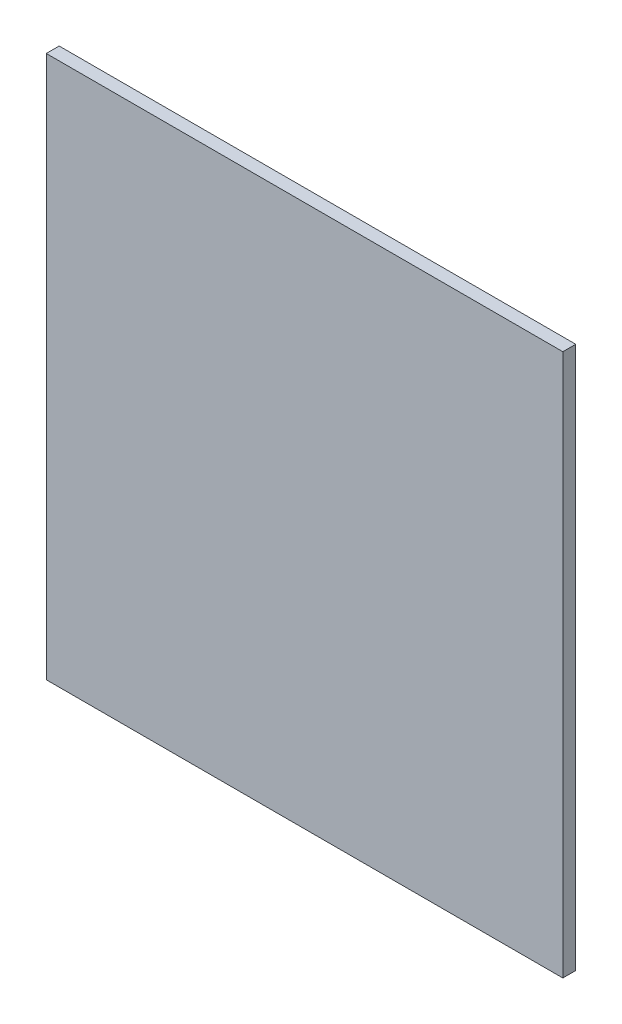
ISO-10303-21;
HEADER;
FILE_DESCRIPTION(('STEP AP214'),'2;1');
FILE_NAME('part.step','',(''),(''),'','','');
FILE_SCHEMA(('AUTOMOTIVE_DESIGN { 1 0 10303 214 1 1 1 1 }'));
ENDSEC;
DATA;
#1=APPLICATION_CONTEXT('core data for automotive mechanical design processes');
#2=APPLICATION_PROTOCOL_DEFINITION('international standard','automotive_design',2000,#1);
#3=PRODUCT_CONTEXT('',#1,'mechanical');
#4=PRODUCT('Part','Part','',(#3));
#5=PRODUCT_RELATED_PRODUCT_CATEGORY('part','',(#4));
#6=PRODUCT_DEFINITION_FORMATION('','',#4);
#7=PRODUCT_DEFINITION_CONTEXT('part definition',#1,'design');
#8=PRODUCT_DEFINITION('design','',#6,#7);
#9=PRODUCT_DEFINITION_SHAPE('','',#8);
#10=(LENGTH_UNIT() NAMED_UNIT(*) SI_UNIT(.MILLI.,.METRE.));
#11=(NAMED_UNIT(*) PLANE_ANGLE_UNIT() SI_UNIT($,.RADIAN.));
#12=(NAMED_UNIT(*) SI_UNIT($,.STERADIAN.) SOLID_ANGLE_UNIT());
#13=UNCERTAINTY_MEASURE_WITH_UNIT(LENGTH_MEASURE(1.E-05),#10,'distance_accuracy_value','');
#14=(GEOMETRIC_REPRESENTATION_CONTEXT(3) GLOBAL_UNCERTAINTY_ASSIGNED_CONTEXT((#13)) GLOBAL_UNIT_ASSIGNED_CONTEXT((#10,
#11,#12)) REPRESENTATION_CONTEXT('',''));
#15=CARTESIAN_POINT('',(0.,0.,0.));
#16=DIRECTION('',(0.,0.,1.));
#17=DIRECTION('',(1.,0.,0.));
#18=AXIS2_PLACEMENT_3D('',#15,#16,#17);
#19=CARTESIAN_POINT('',(0.,204.7625,-4.7625));
#20=DIRECTION('',(-1.,0.,0.));
#21=DIRECTION('',(0.,0.,1.));
#22=AXIS2_PLACEMENT_3D('',#19,#20,#21);
#23=PLANE('',#22);
#24=DIRECTION('',(0.,-1.,0.));
#25=VECTOR('',#24,1.);
#26=CARTESIAN_POINT('',(0.,204.7625,0.));
#27=LINE('',#26,#25);
#28=CARTESIAN_POINT('',(0.,204.7625,0.));
#29=VERTEX_POINT('',#28);
#30=CARTESIAN_POINT('',(0.,4.7625,0.));
#31=VERTEX_POINT('',#30);
#32=EDGE_CURVE('E97',#29,#31,#27,.T.);
#33=ORIENTED_EDGE('',*,*,#32,.F.);
#34=DIRECTION('',(0.,0.,1.));
#35=VECTOR('',#34,1.);
#36=CARTESIAN_POINT('',(0.,204.7625,-4.7625));
#37=LINE('',#36,#35);
#38=CARTESIAN_POINT('',(0.,204.7625,-4.7625));
#39=VERTEX_POINT('',#38);
#40=EDGE_CURVE('E11',#39,#29,#37,.T.);
#41=ORIENTED_EDGE('',*,*,#40,.F.);
#42=DIRECTION('',(0.,-1.,0.));
#43=VECTOR('',#42,1.);
#44=CARTESIAN_POINT('',(0.,204.7625,-4.7625));
#45=LINE('',#44,#43);
#46=CARTESIAN_POINT('',(0.,4.7625,-4.7625));
#47=VERTEX_POINT('',#46);
#48=EDGE_CURVE('E91',#39,#47,#45,.T.);
#49=ORIENTED_EDGE('',*,*,#48,.T.);
#50=DIRECTION('',(0.,0.,1.));
#51=VECTOR('',#50,1.);
#52=CARTESIAN_POINT('',(0.,4.7625,-4.7625));
#53=LINE('',#52,#51);
#54=EDGE_CURVE('E36',#47,#31,#53,.T.);
#55=ORIENTED_EDGE('',*,*,#54,.T.);
#56=EDGE_LOOP('',(#33,#41,#49,#55));
#57=FACE_BOUND('',#56,.T.);
#58=ADVANCED_FACE('F33',(#57),#23,.T.);
#59=CARTESIAN_POINT('',(0.,204.7625,-4.7625));
#60=DIRECTION('',(0.,1.,0.));
#61=DIRECTION('',(0.,0.,1.));
#62=AXIS2_PLACEMENT_3D('',#59,#60,#61);
#63=PLANE('',#62);
#64=DIRECTION('',(-1.,0.,0.));
#65=VECTOR('',#64,1.);
#66=CARTESIAN_POINT('',(0.,204.7625,0.));
#67=LINE('',#66,#65);
#68=CARTESIAN_POINT('',(190.475,204.7625,0.));
#69=VERTEX_POINT('',#68);
#70=EDGE_CURVE('E93',#69,#29,#67,.T.);
#71=ORIENTED_EDGE('',*,*,#70,.F.);
#72=DIRECTION('',(0.,0.,1.));
#73=VECTOR('',#72,1.);
#74=CARTESIAN_POINT('',(190.475,204.7625,-4.7625));
#75=LINE('',#74,#73);
#76=CARTESIAN_POINT('',(190.475,204.7625,-4.7625));
#77=VERTEX_POINT('',#76);
#78=EDGE_CURVE('E42',#77,#69,#75,.T.);
#79=ORIENTED_EDGE('',*,*,#78,.F.);
#80=DIRECTION('',(-1.,0.,0.));
#81=VECTOR('',#80,1.);
#82=CARTESIAN_POINT('',(0.,204.7625,-4.7625));
#83=LINE('',#82,#81);
#84=EDGE_CURVE('E88',#77,#39,#83,.T.);
#85=ORIENTED_EDGE('',*,*,#84,.T.);
#86=ORIENTED_EDGE('',*,*,#40,.T.);
#87=EDGE_LOOP('',(#71,#79,#85,#86));
#88=FACE_BOUND('',#87,.T.);
#89=ADVANCED_FACE('F107',(#88),#63,.T.);
#90=CARTESIAN_POINT('',(190.475,204.7625,-4.7625));
#91=DIRECTION('',(1.,0.,0.));
#92=DIRECTION('',(0.,0.,-1.));
#93=AXIS2_PLACEMENT_3D('',#90,#91,#92);
#94=PLANE('',#93);
#95=DIRECTION('',(0.,1.,0.));
#96=VECTOR('',#95,1.);
#97=CARTESIAN_POINT('',(190.475,204.7625,0.));
#98=LINE('',#97,#96);
#99=CARTESIAN_POINT('',(190.475,4.7625,0.));
#100=VERTEX_POINT('',#99);
#101=EDGE_CURVE('E83',#100,#69,#98,.T.);
#102=ORIENTED_EDGE('',*,*,#101,.F.);
#103=DIRECTION('',(0.,0.,1.));
#104=VECTOR('',#103,1.);
#105=CARTESIAN_POINT('',(190.475,4.7625,-4.7625));
#106=LINE('',#105,#104);
#107=CARTESIAN_POINT('',(190.475,4.7625,-4.7625));
#108=VERTEX_POINT('',#107);
#109=EDGE_CURVE('E78',#108,#100,#106,.T.);
#110=ORIENTED_EDGE('',*,*,#109,.F.);
#111=DIRECTION('',(0.,1.,0.));
#112=VECTOR('',#111,1.);
#113=CARTESIAN_POINT('',(190.475,204.7625,-4.7625));
#114=LINE('',#113,#112);
#115=EDGE_CURVE('E81',#108,#77,#114,.T.);
#116=ORIENTED_EDGE('',*,*,#115,.T.);
#117=ORIENTED_EDGE('',*,*,#78,.T.);
#118=EDGE_LOOP('',(#102,#110,#116,#117));
#119=FACE_BOUND('',#118,.T.);
#120=ADVANCED_FACE('F80',(#119),#94,.T.);
#121=CARTESIAN_POINT('',(0.,4.7625,-4.7625));
#122=DIRECTION('',(0.,-1.,0.));
#123=DIRECTION('',(0.,0.,-1.));
#124=AXIS2_PLACEMENT_3D('',#121,#122,#123);
#125=PLANE('',#124);
#126=DIRECTION('',(1.,0.,0.));
#127=VECTOR('',#126,1.);
#128=CARTESIAN_POINT('',(0.,4.7625,0.));
#129=LINE('',#128,#127);
#130=EDGE_CURVE('E100',#31,#100,#129,.T.);
#131=ORIENTED_EDGE('',*,*,#130,.F.);
#132=ORIENTED_EDGE('',*,*,#54,.F.);
#133=DIRECTION('',(1.,0.,0.));
#134=VECTOR('',#133,1.);
#135=CARTESIAN_POINT('',(0.,4.7625,-4.7625));
#136=LINE('',#135,#134);
#137=EDGE_CURVE('E87',#47,#108,#136,.T.);
#138=ORIENTED_EDGE('',*,*,#137,.T.);
#139=ORIENTED_EDGE('',*,*,#109,.T.);
#140=EDGE_LOOP('',(#131,#132,#138,#139));
#141=FACE_BOUND('',#140,.T.);
#142=ADVANCED_FACE('F90',(#141),#125,.T.);
#143=CARTESIAN_POINT('',(0.,0.,-4.7625));
#144=DIRECTION('',(0.,0.,1.));
#145=DIRECTION('',(1.,0.,0.));
#146=AXIS2_PLACEMENT_3D('',#143,#144,#145);
#147=PLANE('',#146);
#148=ORIENTED_EDGE('',*,*,#48,.F.);
#149=ORIENTED_EDGE('',*,*,#84,.F.);
#150=ORIENTED_EDGE('',*,*,#115,.F.);
#151=ORIENTED_EDGE('',*,*,#137,.F.);
#152=EDGE_LOOP('',(#148,#149,#150,#151));
#153=FACE_BOUND('',#152,.T.);
#154=ADVANCED_FACE('F86',(#153),#147,.F.);
#155=CARTESIAN_POINT('',(0.,0.,0.));
#156=DIRECTION('',(0.,0.,1.));
#157=DIRECTION('',(1.,0.,0.));
#158=AXIS2_PLACEMENT_3D('',#155,#156,#157);
#159=PLANE('',#158);
#160=ORIENTED_EDGE('',*,*,#32,.T.);
#161=ORIENTED_EDGE('',*,*,#130,.T.);
#162=ORIENTED_EDGE('',*,*,#101,.T.);
#163=ORIENTED_EDGE('',*,*,#70,.T.);
#164=EDGE_LOOP('',(#160,#161,#162,#163));
#165=FACE_BOUND('',#164,.T.);
#166=ADVANCED_FACE('F106',(#165),#159,.T.);
#167=CLOSED_SHELL('',(#58,#89,#120,#142,#154,#166));
#168=MANIFOLD_SOLID_BREP('B2',#167);
#169=ADVANCED_BREP_SHAPE_REPRESENTATION('',(#18,#168),#14);
#170=SHAPE_DEFINITION_REPRESENTATION(#9,#169);
ENDSEC;
END-ISO-10303-21;
